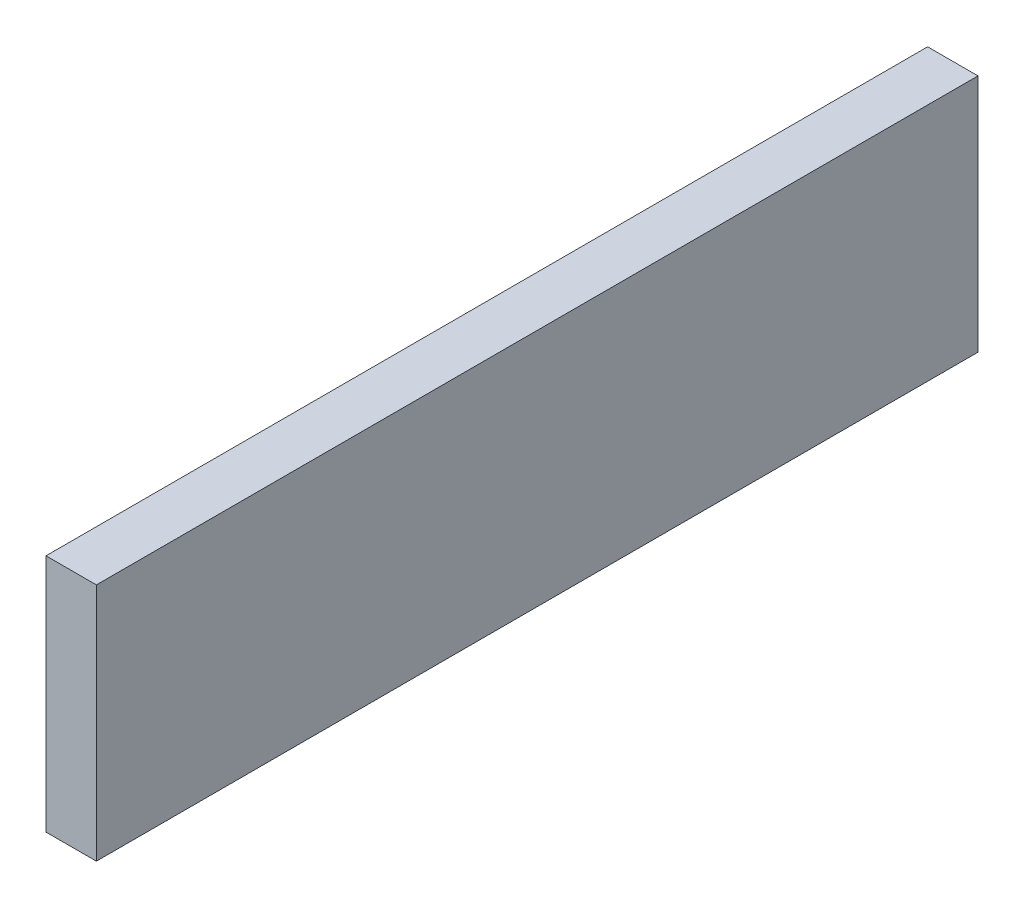
ISO-10303-21;
HEADER;
FILE_DESCRIPTION(('STEP AP214'),'2;1');
FILE_NAME('part.step','',(''),(''),'','','');
FILE_SCHEMA(('AUTOMOTIVE_DESIGN { 1 0 10303 214 1 1 1 1 }'));
ENDSEC;
DATA;
#1=APPLICATION_CONTEXT('core data for automotive mechanical design processes');
#2=APPLICATION_PROTOCOL_DEFINITION('international standard','automotive_design',2000,#1);
#3=PRODUCT_CONTEXT('',#1,'mechanical');
#4=PRODUCT('Part','Part','',(#3));
#5=PRODUCT_RELATED_PRODUCT_CATEGORY('part','',(#4));
#6=PRODUCT_DEFINITION_FORMATION('','',#4);
#7=PRODUCT_DEFINITION_CONTEXT('part definition',#1,'design');
#8=PRODUCT_DEFINITION('design','',#6,#7);
#9=PRODUCT_DEFINITION_SHAPE('','',#8);
#10=(LENGTH_UNIT() NAMED_UNIT(*) SI_UNIT(.MILLI.,.METRE.));
#11=(NAMED_UNIT(*) PLANE_ANGLE_UNIT() SI_UNIT($,.RADIAN.));
#12=(NAMED_UNIT(*) SI_UNIT($,.STERADIAN.) SOLID_ANGLE_UNIT());
#13=UNCERTAINTY_MEASURE_WITH_UNIT(LENGTH_MEASURE(1.E-05),#10,'distance_accuracy_value','');
#14=(GEOMETRIC_REPRESENTATION_CONTEXT(3) GLOBAL_UNCERTAINTY_ASSIGNED_CONTEXT((#13)) GLOBAL_UNIT_ASSIGNED_CONTEXT((#10,
#11,#12)) REPRESENTATION_CONTEXT('',''));
#15=CARTESIAN_POINT('',(0.,0.,0.));
#16=DIRECTION('',(0.,0.,1.));
#17=DIRECTION('',(1.,0.,0.));
#18=AXIS2_PLACEMENT_3D('',#15,#16,#17);
#19=CARTESIAN_POINT('',(-12.7,120.65,-444.5));
#20=DIRECTION('',(-1.,0.,0.));
#21=DIRECTION('',(0.,-1.,0.));
#22=AXIS2_PLACEMENT_3D('',#19,#20,#21);
#23=PLANE('',#22);
#24=DIRECTION('',(0.,-1.,0.));
#25=VECTOR('',#24,1.);
#26=CARTESIAN_POINT('',(-12.7,120.65,0.));
#27=LINE('',#26,#25);
#28=CARTESIAN_POINT('',(-12.7,120.65,0.));
#29=VERTEX_POINT('',#28);
#30=CARTESIAN_POINT('',(-12.7,0.,0.));
#31=VERTEX_POINT('',#30);
#32=EDGE_CURVE('E70',#29,#31,#27,.T.);
#33=ORIENTED_EDGE('',*,*,#32,.F.);
#34=DIRECTION('',(0.,0.,1.));
#35=VECTOR('',#34,1.);
#36=CARTESIAN_POINT('',(-12.7,120.65,-444.5));
#37=LINE('',#36,#35);
#38=CARTESIAN_POINT('',(-12.7,120.65,-444.5));
#39=VERTEX_POINT('',#38);
#40=EDGE_CURVE('E11',#39,#29,#37,.T.);
#41=ORIENTED_EDGE('',*,*,#40,.F.);
#42=DIRECTION('',(0.,-1.,0.));
#43=VECTOR('',#42,1.);
#44=CARTESIAN_POINT('',(-12.7,120.65,-444.5));
#45=LINE('',#44,#43);
#46=CARTESIAN_POINT('',(-12.7,0.,-444.5));
#47=VERTEX_POINT('',#46);
#48=EDGE_CURVE('E72',#39,#47,#45,.T.);
#49=ORIENTED_EDGE('',*,*,#48,.T.);
#50=DIRECTION('',(0.,0.,1.));
#51=VECTOR('',#50,1.);
#52=CARTESIAN_POINT('',(-12.7,0.,-444.5));
#53=LINE('',#52,#51);
#54=EDGE_CURVE('E33',#47,#31,#53,.T.);
#55=ORIENTED_EDGE('',*,*,#54,.T.);
#56=EDGE_LOOP('',(#33,#41,#49,#55));
#57=FACE_BOUND('',#56,.T.);
#58=ADVANCED_FACE('F30',(#57),#23,.T.);
#59=CARTESIAN_POINT('',(-12.7,120.65,-444.5));
#60=DIRECTION('',(0.,1.,0.));
#61=DIRECTION('',(0.,0.,1.));
#62=AXIS2_PLACEMENT_3D('',#59,#60,#61);
#63=PLANE('',#62);
#64=DIRECTION('',(-1.,0.,0.));
#65=VECTOR('',#64,1.);
#66=CARTESIAN_POINT('',(-12.7,120.65,0.));
#67=LINE('',#66,#65);
#68=CARTESIAN_POINT('',(12.7,120.65,0.));
#69=VERTEX_POINT('',#68);
#70=EDGE_CURVE('E87',#69,#29,#67,.T.);
#71=ORIENTED_EDGE('',*,*,#70,.F.);
#72=DIRECTION('',(0.,0.,1.));
#73=VECTOR('',#72,1.);
#74=CARTESIAN_POINT('',(12.7,120.65,-444.5));
#75=LINE('',#74,#73);
#76=CARTESIAN_POINT('',(12.7,120.65,-444.5));
#77=VERTEX_POINT('',#76);
#78=EDGE_CURVE('E38',#77,#69,#75,.T.);
#79=ORIENTED_EDGE('',*,*,#78,.F.);
#80=DIRECTION('',(-1.,0.,0.));
#81=VECTOR('',#80,1.);
#82=CARTESIAN_POINT('',(-12.7,120.65,-444.5));
#83=LINE('',#82,#81);
#84=EDGE_CURVE('E77',#77,#39,#83,.T.);
#85=ORIENTED_EDGE('',*,*,#84,.T.);
#86=ORIENTED_EDGE('',*,*,#40,.T.);
#87=EDGE_LOOP('',(#71,#79,#85,#86));
#88=FACE_BOUND('',#87,.T.);
#89=ADVANCED_FACE('F102',(#88),#63,.T.);
#90=CARTESIAN_POINT('',(12.7,120.65,-444.5));
#91=DIRECTION('',(1.,0.,0.));
#92=DIRECTION('',(0.,1.,0.));
#93=AXIS2_PLACEMENT_3D('',#90,#91,#92);
#94=PLANE('',#93);
#95=DIRECTION('',(0.,1.,0.));
#96=VECTOR('',#95,1.);
#97=CARTESIAN_POINT('',(12.7,120.65,0.));
#98=LINE('',#97,#96);
#99=CARTESIAN_POINT('',(12.7,0.,0.));
#100=VERTEX_POINT('',#99);
#101=EDGE_CURVE('E84',#100,#69,#98,.T.);
#102=ORIENTED_EDGE('',*,*,#101,.F.);
#103=DIRECTION('',(0.,0.,1.));
#104=VECTOR('',#103,1.);
#105=CARTESIAN_POINT('',(12.7,0.,-444.5));
#106=LINE('',#105,#104);
#107=CARTESIAN_POINT('',(12.7,0.,-444.5));
#108=VERTEX_POINT('',#107);
#109=EDGE_CURVE('E76',#108,#100,#106,.T.);
#110=ORIENTED_EDGE('',*,*,#109,.F.);
#111=DIRECTION('',(0.,1.,0.));
#112=VECTOR('',#111,1.);
#113=CARTESIAN_POINT('',(12.7,120.65,-444.5));
#114=LINE('',#113,#112);
#115=EDGE_CURVE('E95',#108,#77,#114,.T.);
#116=ORIENTED_EDGE('',*,*,#115,.T.);
#117=ORIENTED_EDGE('',*,*,#78,.T.);
#118=EDGE_LOOP('',(#102,#110,#116,#117));
#119=FACE_BOUND('',#118,.T.);
#120=ADVANCED_FACE('F99',(#119),#94,.T.);
#121=CARTESIAN_POINT('',(-12.7,0.,-444.5));
#122=DIRECTION('',(0.,-1.,0.));
#123=DIRECTION('',(0.,0.,-1.));
#124=AXIS2_PLACEMENT_3D('',#121,#122,#123);
#125=PLANE('',#124);
#126=DIRECTION('',(1.,0.,0.));
#127=VECTOR('',#126,1.);
#128=CARTESIAN_POINT('',(-12.7,0.,0.));
#129=LINE('',#128,#127);
#130=EDGE_CURVE('E79',#31,#100,#129,.T.);
#131=ORIENTED_EDGE('',*,*,#130,.F.);
#132=ORIENTED_EDGE('',*,*,#54,.F.);
#133=DIRECTION('',(1.,0.,0.));
#134=VECTOR('',#133,1.);
#135=CARTESIAN_POINT('',(-12.7,0.,-444.5));
#136=LINE('',#135,#134);
#137=EDGE_CURVE('E93',#47,#108,#136,.T.);
#138=ORIENTED_EDGE('',*,*,#137,.T.);
#139=ORIENTED_EDGE('',*,*,#109,.T.);
#140=EDGE_LOOP('',(#131,#132,#138,#139));
#141=FACE_BOUND('',#140,.T.);
#142=ADVANCED_FACE('F80',(#141),#125,.T.);
#143=CARTESIAN_POINT('',(-12.7,0.,-444.5));
#144=DIRECTION('',(0.,0.,1.));
#145=DIRECTION('',(1.,0.,0.));
#146=AXIS2_PLACEMENT_3D('',#143,#144,#145);
#147=PLANE('',#146);
#148=ORIENTED_EDGE('',*,*,#48,.F.);
#149=ORIENTED_EDGE('',*,*,#84,.F.);
#150=ORIENTED_EDGE('',*,*,#115,.F.);
#151=ORIENTED_EDGE('',*,*,#137,.F.);
#152=EDGE_LOOP('',(#148,#149,#150,#151));
#153=FACE_BOUND('',#152,.T.);
#154=ADVANCED_FACE('F104',(#153),#147,.F.);
#155=CARTESIAN_POINT('',(-12.7,0.,0.));
#156=DIRECTION('',(0.,0.,1.));
#157=DIRECTION('',(1.,0.,0.));
#158=AXIS2_PLACEMENT_3D('',#155,#156,#157);
#159=PLANE('',#158);
#160=ORIENTED_EDGE('',*,*,#32,.T.);
#161=ORIENTED_EDGE('',*,*,#130,.T.);
#162=ORIENTED_EDGE('',*,*,#101,.T.);
#163=ORIENTED_EDGE('',*,*,#70,.T.);
#164=EDGE_LOOP('',(#160,#161,#162,#163));
#165=FACE_BOUND('',#164,.T.);
#166=ADVANCED_FACE('F86',(#165),#159,.T.);
#167=CLOSED_SHELL('',(#58,#89,#120,#142,#154,#166));
#168=MANIFOLD_SOLID_BREP('B2',#167);
#169=ADVANCED_BREP_SHAPE_REPRESENTATION('',(#18,#168),#14);
#170=SHAPE_DEFINITION_REPRESENTATION(#9,#169);
ENDSEC;
END-ISO-10303-21;
